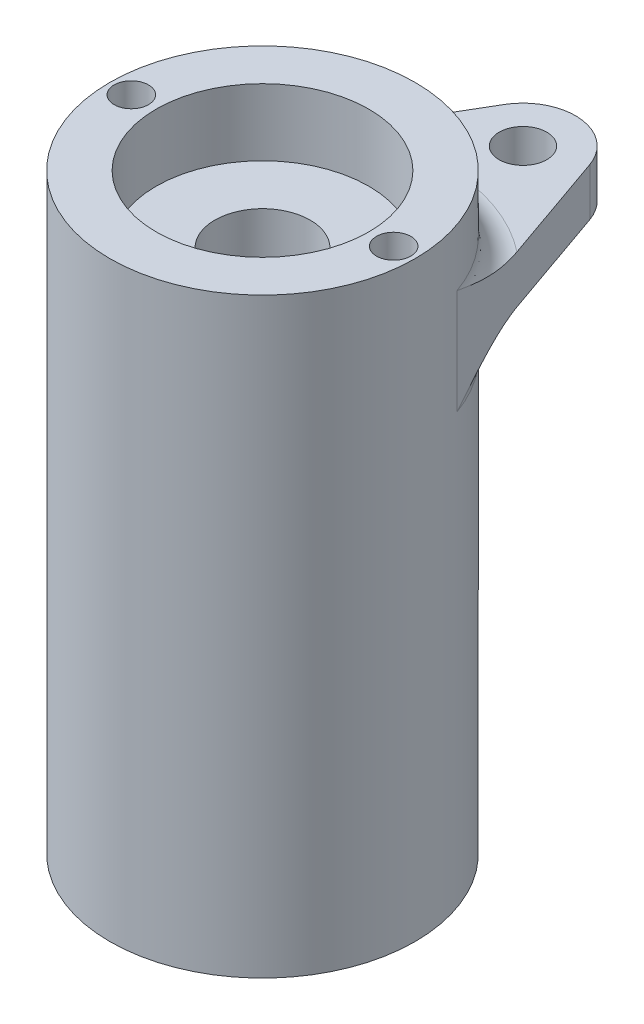
ISO-10303-21;
HEADER;
FILE_DESCRIPTION(('STEP AP214'),'2;1');
FILE_NAME('part.step','',(''),(''),'','','');
FILE_SCHEMA(('AUTOMOTIVE_DESIGN { 1 0 10303 214 1 1 1 1 }'));
ENDSEC;
DATA;
#1=APPLICATION_CONTEXT('core data for automotive mechanical design processes');
#2=APPLICATION_PROTOCOL_DEFINITION('international standard','automotive_design',2000,#1);
#3=PRODUCT_CONTEXT('',#1,'mechanical');
#4=PRODUCT('Part','Part','',(#3));
#5=PRODUCT_RELATED_PRODUCT_CATEGORY('part','',(#4));
#6=PRODUCT_DEFINITION_FORMATION('','',#4);
#7=PRODUCT_DEFINITION_CONTEXT('part definition',#1,'design');
#8=PRODUCT_DEFINITION('design','',#6,#7);
#9=PRODUCT_DEFINITION_SHAPE('','',#8);
#10=(LENGTH_UNIT() NAMED_UNIT(*) SI_UNIT(.MILLI.,.METRE.));
#11=(NAMED_UNIT(*) PLANE_ANGLE_UNIT() SI_UNIT($,.RADIAN.));
#12=(NAMED_UNIT(*) SI_UNIT($,.STERADIAN.) SOLID_ANGLE_UNIT());
#13=UNCERTAINTY_MEASURE_WITH_UNIT(LENGTH_MEASURE(1.E-05),#10,'distance_accuracy_value','');
#14=(GEOMETRIC_REPRESENTATION_CONTEXT(3) GLOBAL_UNCERTAINTY_ASSIGNED_CONTEXT((#13)) GLOBAL_UNIT_ASSIGNED_CONTEXT((#10,
#11,#12)) REPRESENTATION_CONTEXT('',''));
#15=CARTESIAN_POINT('',(0.,0.,0.));
#16=DIRECTION('',(0.,0.,1.));
#17=DIRECTION('',(1.,0.,0.));
#18=AXIS2_PLACEMENT_3D('',#15,#16,#17);
#19=CARTESIAN_POINT('',(0.,62.,0.));
#20=DIRECTION('',(0.,-1.,0.));
#21=DIRECTION('',(0.,0.,-1.));
#22=AXIS2_PLACEMENT_3D('',#19,#20,#21);
#23=CYLINDRICAL_SURFACE('',#22,16.);
#24=CARTESIAN_POINT('',(0.,0.,0.));
#25=DIRECTION('',(0.,1.,0.));
#26=DIRECTION('',(0.,0.,1.));
#27=AXIS2_PLACEMENT_3D('',#24,#25,#26);
#28=CIRCLE('',#27,16.);
#29=CARTESIAN_POINT('',(0.,0.,16.));
#30=VERTEX_POINT('',#29);
#31=EDGE_CURVE('E160',#30,#30,#28,.T.);
#32=ORIENTED_EDGE('',*,*,#31,.T.);
#33=EDGE_LOOP('',(#32));
#34=FACE_BOUND('',#33,.T.);
#35=CARTESIAN_POINT('',(0.,62.,0.));
#36=DIRECTION('',(0.,1.,0.));
#37=DIRECTION('',(0.,0.,1.));
#38=AXIS2_PLACEMENT_3D('',#35,#36,#37);
#39=CIRCLE('',#38,16.);
#40=CARTESIAN_POINT('',(0.,62.,16.));
#41=VERTEX_POINT('',#40);
#42=EDGE_CURVE('E156',#41,#41,#39,.T.);
#43=ORIENTED_EDGE('',*,*,#42,.F.);
#44=EDGE_LOOP('',(#43));
#45=FACE_BOUND('',#44,.T.);
#46=CARTESIAN_POINT('',(0.,56.,0.));
#47=DIRECTION('',(0.,1.,0.));
#48=DIRECTION('',(0.,0.,1.));
#49=AXIS2_PLACEMENT_3D('',#46,#47,#48);
#50=CIRCLE('',#49,16.);
#51=CARTESIAN_POINT('',(15.1031592391606,56.,-5.28153206906466));
#52=VERTEX_POINT('',#51);
#53=CARTESIAN_POINT('',(-13.8009834945247,56.,-8.0952365366219));
#54=VERTEX_POINT('',#53);
#55=EDGE_CURVE('E169',#52,#54,#50,.T.);
#56=ORIENTED_EDGE('',*,*,#55,.T.);
#57=DIRECTION('',(0.,1.,0.));
#58=VECTOR('',#57,1.);
#59=CARTESIAN_POINT('',(-13.8009834945246,48.,-8.0952365366219));
#60=LINE('',#59,#58);
#61=CARTESIAN_POINT('',(-13.8009834945247,45.,-8.0952365366219));
#62=VERTEX_POINT('',#61);
#63=EDGE_CURVE('E138',#62,#54,#60,.T.);
#64=ORIENTED_EDGE('',*,*,#63,.F.);
#65=CARTESIAN_POINT('',(0.,45.,0.));
#66=DIRECTION('',(0.,1.,0.));
#67=DIRECTION('',(0.,0.,1.));
#68=AXIS2_PLACEMENT_3D('',#65,#66,#67);
#69=CIRCLE('',#68,16.);
#70=CARTESIAN_POINT('',(15.1031592391606,45.,-5.28153206906466));
#71=VERTEX_POINT('',#70);
#72=EDGE_CURVE('E159',#62,#71,#69,.F.);
#73=ORIENTED_EDGE('',*,*,#72,.T.);
#74=DIRECTION('',(0.,1.,0.));
#75=VECTOR('',#74,1.);
#76=CARTESIAN_POINT('',(15.1031592391606,48.,-5.28153206906466));
#77=LINE('',#76,#75);
#78=EDGE_CURVE('E111',#71,#52,#77,.T.);
#79=ORIENTED_EDGE('',*,*,#78,.T.);
#80=EDGE_LOOP('',(#56,#64,#73,#79));
#81=FACE_BOUND('',#80,.T.);
#82=ADVANCED_FACE('F42',(#34,#45,#81),#23,.T.);
#83=CARTESIAN_POINT('',(0.,62.,0.));
#84=DIRECTION('',(0.,-1.,0.));
#85=DIRECTION('',(0.,0.,-1.));
#86=AXIS2_PLACEMENT_3D('',#83,#84,#85);
#87=CYLINDRICAL_SURFACE('',#86,5.);
#88=CARTESIAN_POINT('',(0.,55.,0.));
#89=DIRECTION('',(0.,1.,0.));
#90=DIRECTION('',(0.,0.,1.));
#91=AXIS2_PLACEMENT_3D('',#88,#89,#90);
#92=CIRCLE('',#91,5.);
#93=CARTESIAN_POINT('',(0.,55.,5.));
#94=VERTEX_POINT('',#93);
#95=EDGE_CURVE('E152',#94,#94,#92,.T.);
#96=ORIENTED_EDGE('',*,*,#95,.T.);
#97=EDGE_LOOP('',(#96));
#98=FACE_BOUND('',#97,.T.);
#99=CARTESIAN_POINT('',(0.,7.,0.));
#100=DIRECTION('',(0.,-1.,0.));
#101=DIRECTION('',(0.,0.,-1.));
#102=AXIS2_PLACEMENT_3D('',#99,#100,#101);
#103=CIRCLE('',#102,5.);
#104=CARTESIAN_POINT('',(0.,7.,-5.));
#105=VERTEX_POINT('',#104);
#106=EDGE_CURVE('E146',#105,#105,#103,.T.);
#107=ORIENTED_EDGE('',*,*,#106,.T.);
#108=EDGE_LOOP('',(#107));
#109=FACE_BOUND('',#108,.T.);
#110=ADVANCED_FACE('F201',(#98,#109),#87,.F.);
#111=CARTESIAN_POINT('',(0.,62.,0.));
#112=DIRECTION('',(0.,1.,0.));
#113=DIRECTION('',(0.,0.,1.));
#114=AXIS2_PLACEMENT_3D('',#111,#112,#113);
#115=PLANE('',#114);
#116=CARTESIAN_POINT('',(-13.75,62.,0.));
#117=DIRECTION('',(0.,1.,0.));
#118=DIRECTION('',(0.,0.,1.));
#119=AXIS2_PLACEMENT_3D('',#116,#117,#118);
#120=CIRCLE('',#119,1.8);
#121=CARTESIAN_POINT('',(-13.75,62.,1.8));
#122=VERTEX_POINT('',#121);
#123=EDGE_CURVE('E450',#122,#122,#120,.T.);
#124=ORIENTED_EDGE('',*,*,#123,.F.);
#125=EDGE_LOOP('',(#124));
#126=FACE_BOUND('',#125,.T.);
#127=CARTESIAN_POINT('',(13.75,62.,0.));
#128=DIRECTION('',(0.,1.,0.));
#129=DIRECTION('',(0.,0.,1.));
#130=AXIS2_PLACEMENT_3D('',#127,#128,#129);
#131=CIRCLE('',#130,1.8);
#132=CARTESIAN_POINT('',(13.75,62.,1.8));
#133=VERTEX_POINT('',#132);
#134=EDGE_CURVE('E447',#133,#133,#131,.T.);
#135=ORIENTED_EDGE('',*,*,#134,.F.);
#136=EDGE_LOOP('',(#135));
#137=FACE_BOUND('',#136,.T.);
#138=CARTESIAN_POINT('',(0.,62.,0.));
#139=DIRECTION('',(0.,1.,0.));
#140=DIRECTION('',(0.,0.,1.));
#141=AXIS2_PLACEMENT_3D('',#138,#139,#140);
#142=CIRCLE('',#141,11.15);
#143=CARTESIAN_POINT('',(0.,62.,11.15));
#144=VERTEX_POINT('',#143);
#145=EDGE_CURVE('E153',#144,#144,#142,.T.);
#146=ORIENTED_EDGE('',*,*,#145,.F.);
#147=EDGE_LOOP('',(#146));
#148=FACE_BOUND('',#147,.T.);
#149=ORIENTED_EDGE('',*,*,#42,.T.);
#150=EDGE_LOOP('',(#149));
#151=FACE_BOUND('',#150,.T.);
#152=ADVANCED_FACE('F207',(#126,#137,#148,#151),#115,.T.);
#153=CARTESIAN_POINT('',(0.,0.,0.));
#154=DIRECTION('',(0.,1.,0.));
#155=DIRECTION('',(0.,0.,1.));
#156=AXIS2_PLACEMENT_3D('',#153,#154,#155);
#157=PLANE('',#156);
#158=CARTESIAN_POINT('',(-13.75,0.,0.));
#159=DIRECTION('',(0.,-1.,0.));
#160=DIRECTION('',(0.,0.,-1.));
#161=AXIS2_PLACEMENT_3D('',#158,#159,#160);
#162=CIRCLE('',#161,1.8);
#163=CARTESIAN_POINT('',(-13.75,0.,-1.8));
#164=VERTEX_POINT('',#163);
#165=EDGE_CURVE('E453',#164,#164,#162,.T.);
#166=ORIENTED_EDGE('',*,*,#165,.F.);
#167=EDGE_LOOP('',(#166));
#168=FACE_BOUND('',#167,.T.);
#169=CARTESIAN_POINT('',(13.75,0.,0.));
#170=DIRECTION('',(0.,-1.,0.));
#171=DIRECTION('',(0.,0.,-1.));
#172=AXIS2_PLACEMENT_3D('',#169,#170,#171);
#173=CIRCLE('',#172,1.8);
#174=CARTESIAN_POINT('',(13.75,0.,-1.8));
#175=VERTEX_POINT('',#174);
#176=EDGE_CURVE('E460',#175,#175,#173,.T.);
#177=ORIENTED_EDGE('',*,*,#176,.F.);
#178=EDGE_LOOP('',(#177));
#179=FACE_BOUND('',#178,.T.);
#180=CARTESIAN_POINT('',(0.,0.,0.));
#181=DIRECTION('',(0.,-1.,0.));
#182=DIRECTION('',(0.,0.,-1.));
#183=AXIS2_PLACEMENT_3D('',#180,#181,#182);
#184=CIRCLE('',#183,11.15);
#185=CARTESIAN_POINT('',(0.,0.,-11.15));
#186=VERTEX_POINT('',#185);
#187=EDGE_CURVE('E140',#186,#186,#184,.T.);
#188=ORIENTED_EDGE('',*,*,#187,.F.);
#189=EDGE_LOOP('',(#188));
#190=FACE_BOUND('',#189,.T.);
#191=ORIENTED_EDGE('',*,*,#31,.F.);
#192=EDGE_LOOP('',(#191));
#193=FACE_BOUND('',#192,.T.);
#194=ADVANCED_FACE('F203',(#168,#179,#190,#193),#157,.F.);
#195=CARTESIAN_POINT('',(0.,55.,0.));
#196=DIRECTION('',(0.,1.,0.));
#197=DIRECTION('',(0.,0.,1.));
#198=AXIS2_PLACEMENT_3D('',#195,#196,#197);
#199=CYLINDRICAL_SURFACE('',#198,11.15);
#200=CARTESIAN_POINT('',(0.,55.,0.));
#201=DIRECTION('',(0.,1.,0.));
#202=DIRECTION('',(0.,0.,1.));
#203=AXIS2_PLACEMENT_3D('',#200,#201,#202);
#204=CIRCLE('',#203,11.15);
#205=CARTESIAN_POINT('',(0.,55.,11.15));
#206=VERTEX_POINT('',#205);
#207=EDGE_CURVE('E149',#206,#206,#204,.T.);
#208=ORIENTED_EDGE('',*,*,#207,.F.);
#209=EDGE_LOOP('',(#208));
#210=FACE_BOUND('',#209,.T.);
#211=ORIENTED_EDGE('',*,*,#145,.T.);
#212=EDGE_LOOP('',(#211));
#213=FACE_BOUND('',#212,.T.);
#214=ADVANCED_FACE('F206',(#210,#213),#199,.F.);
#215=CARTESIAN_POINT('',(0.,55.,0.));
#216=DIRECTION('',(0.,1.,0.));
#217=DIRECTION('',(0.,0.,1.));
#218=AXIS2_PLACEMENT_3D('',#215,#216,#217);
#219=PLANE('',#218);
#220=ORIENTED_EDGE('',*,*,#95,.F.);
#221=EDGE_LOOP('',(#220));
#222=FACE_BOUND('',#221,.T.);
#223=ORIENTED_EDGE('',*,*,#207,.T.);
#224=EDGE_LOOP('',(#223));
#225=FACE_BOUND('',#224,.T.);
#226=ADVANCED_FACE('F217',(#222,#225),#219,.T.);
#227=CARTESIAN_POINT('',(0.,7.,0.));
#228=DIRECTION('',(0.,-1.,0.));
#229=DIRECTION('',(0.,0.,-1.));
#230=AXIS2_PLACEMENT_3D('',#227,#228,#229);
#231=CYLINDRICAL_SURFACE('',#230,11.15);
#232=CARTESIAN_POINT('',(0.,7.,0.));
#233=DIRECTION('',(0.,-1.,0.));
#234=DIRECTION('',(0.,0.,-1.));
#235=AXIS2_PLACEMENT_3D('',#232,#233,#234);
#236=CIRCLE('',#235,11.15);
#237=CARTESIAN_POINT('',(0.,7.,-11.15));
#238=VERTEX_POINT('',#237);
#239=EDGE_CURVE('E143',#238,#238,#236,.T.);
#240=ORIENTED_EDGE('',*,*,#239,.F.);
#241=EDGE_LOOP('',(#240));
#242=FACE_BOUND('',#241,.T.);
#243=ORIENTED_EDGE('',*,*,#187,.T.);
#244=EDGE_LOOP('',(#243));
#245=FACE_BOUND('',#244,.T.);
#246=ADVANCED_FACE('F221',(#242,#245),#231,.F.);
#247=CARTESIAN_POINT('',(0.,7.,0.));
#248=DIRECTION('',(0.,-1.,0.));
#249=DIRECTION('',(0.,0.,-1.));
#250=AXIS2_PLACEMENT_3D('',#247,#248,#249);
#251=PLANE('',#250);
#252=ORIENTED_EDGE('',*,*,#106,.F.);
#253=EDGE_LOOP('',(#252));
#254=FACE_BOUND('',#253,.T.);
#255=ORIENTED_EDGE('',*,*,#239,.T.);
#256=EDGE_LOOP('',(#255));
#257=FACE_BOUND('',#256,.T.);
#258=ADVANCED_FACE('F225',(#254,#257),#251,.T.);
#259=CARTESIAN_POINT('',(-13.8009834945246,48.,-8.09523653662189));
#260=DIRECTION('',(-0.862561468407791,0.,-0.505952283538869));
#261=DIRECTION('',(-0.505952283538869,0.,0.862561468407791));
#262=AXIS2_PLACEMENT_3D('',#259,#260,#261);
#263=PLANE('',#262);
#264=DIRECTION('',(-0.505952283538869,0.,0.862561468407791));
#265=VECTOR('',#264,1.);
#266=CARTESIAN_POINT('',(-13.8009834945246,53.,-8.09523653662189));
#267=LINE('',#266,#265);
#268=CARTESIAN_POINT('',(-2.32188617029805,53.,-27.6651196384939));
#269=VERTEX_POINT('',#268);
#270=CARTESIAN_POINT('',(-8.61651535517702,53.,-16.9338614360104));
#271=VERTEX_POINT('',#270);
#272=EDGE_CURVE('E133',#269,#271,#267,.T.);
#273=ORIENTED_EDGE('',*,*,#272,.F.);
#274=DIRECTION('',(0.,1.,0.));
#275=VECTOR('',#274,1.);
#276=CARTESIAN_POINT('',(-2.32188617029805,48.,-27.6651196384939));
#277=LINE('',#276,#275);
#278=CARTESIAN_POINT('',(-2.32188617029805,48.,-27.6651196384939));
#279=VERTEX_POINT('',#278);
#280=EDGE_CURVE('E110',#279,#269,#277,.T.);
#281=ORIENTED_EDGE('',*,*,#280,.F.);
#282=DIRECTION('',(-0.505952283538869,0.,0.862561468407791));
#283=VECTOR('',#282,1.);
#284=CARTESIAN_POINT('',(-13.8009834945246,48.,-8.09523653662189));
#285=LINE('',#284,#283);
#286=CARTESIAN_POINT('',(-8.61651535517702,48.,-16.9338614360104));
#287=VERTEX_POINT('',#286);
#288=EDGE_CURVE('E121',#279,#287,#285,.T.);
#289=ORIENTED_EDGE('',*,*,#288,.T.);
#290=CARTESIAN_POINT('',(-8.61651535517702,48.,-16.9338614360104));
#291=CARTESIAN_POINT('',(-8.71445419242083,47.9999723465463,-16.7668925932644));
#292=CARTESIAN_POINT('',(-8.8123613365206,47.9945523342321,-16.5999777818683));
#293=CARTESIAN_POINT('',(-9.00786274585275,47.9740375800748,-16.2666815636363));
#294=CARTESIAN_POINT('',(-9.10545716102817,47.9589485200903,-16.1002999011734));
#295=CARTESIAN_POINT('',(-9.29992552323059,47.920257455875,-15.7687648503047));
#296=CARTESIAN_POINT('',(-9.39680072404127,47.8966794863374,-15.6036093244138));
#297=CARTESIAN_POINT('',(-9.59000844346445,47.8419229614435,-15.2742234522764));
#298=CARTESIAN_POINT('',(-9.6863408711389,47.8107431690484,-15.1099932610636));
#299=CARTESIAN_POINT('',(-9.97235239533583,47.7078061931678,-14.6223928917811));
#300=CARTESIAN_POINT('',(-10.1611315677937,47.6261985755592,-14.3005569291857));
#301=CARTESIAN_POINT('',(-10.536136776593,47.4419557697291,-13.6612376611709));
#302=CARTESIAN_POINT('',(-10.7223605760605,47.3393032743636,-13.3437581692362));
#303=CARTESIAN_POINT('',(-11.1537719489292,47.0806264610122,-12.6082761102034));
#304=CARTESIAN_POINT('',(-11.3979702122182,46.9182063934113,-12.1919601463898));
#305=CARTESIAN_POINT('',(-11.8825438209057,46.5729644332339,-11.3658456350812));
#306=CARTESIAN_POINT('',(-12.1229195034477,46.390144351425,-10.9560465128148));
#307=CARTESIAN_POINT('',(-12.8413362090285,45.8212504522022,-9.73126981221338));
#308=CARTESIAN_POINT('',(-13.3153466785992,45.4156255583478,-8.92316363308133));
#309=CARTESIAN_POINT('',(-13.793152963837,45.0067016446875,-8.10858624225246));
#310=CARTESIAN_POINT('',(-13.797068231779,45.0033508132231,-8.10191138500768));
#311=CARTESIAN_POINT('',(-13.8009834945247,45.,-8.09523653662189));
#312=B_SPLINE_CURVE_WITH_KNOTS('',3,(#290,#291,#292,#293,#294,#295,#296,#297,#298,#299,#300,
#301,#302,#303,#304,#305,#306,#307,#308,#309,#310,#311),.UNSPECIFIED.,.F.,.F.,(4,2,2,2,2,2,2,2,
2,2,4),(0.,0.580554602102552,1.16076836319845,1.73935211671656,2.31803008564743,
3.46297470364884,4.60886471982271,6.13587900251326,7.6627578504093,10.7247640326782,
10.7500622539597),.UNSPECIFIED.);
#313=EDGE_CURVE('E56',#287,#62,#312,.T.);
#314=ORIENTED_EDGE('',*,*,#313,.T.);
#315=ORIENTED_EDGE('',*,*,#63,.T.);
#316=CARTESIAN_POINT('',(-8.61651535517702,53.,-16.9338614360104));
#317=CARTESIAN_POINT('',(-8.71445419242083,53.0000276534537,-16.7668925932644));
#318=CARTESIAN_POINT('',(-8.8123613365206,53.0054476657679,-16.5999777818683));
#319=CARTESIAN_POINT('',(-9.00786274585275,53.0259624199252,-16.2666815636363));
#320=CARTESIAN_POINT('',(-9.10545716102817,53.0410514799097,-16.1002999011734));
#321=CARTESIAN_POINT('',(-9.29992552323059,53.079742544125,-15.7687648503047));
#322=CARTESIAN_POINT('',(-9.39680072404127,53.1033205136626,-15.6036093244138));
#323=CARTESIAN_POINT('',(-9.59000844346445,53.1580770385565,-15.2742234522764));
#324=CARTESIAN_POINT('',(-9.6863408711389,53.1892568309516,-15.1099932610636));
#325=CARTESIAN_POINT('',(-9.97235239533583,53.2921938068322,-14.6223928917811));
#326=CARTESIAN_POINT('',(-10.1611315677937,53.3738014244408,-14.3005569291857));
#327=CARTESIAN_POINT('',(-10.536136776593,53.5580442302709,-13.6612376611709));
#328=CARTESIAN_POINT('',(-10.7223605760605,53.6606967256364,-13.3437581692362));
#329=CARTESIAN_POINT('',(-11.1537719489292,53.9193735389878,-12.6082761102034));
#330=CARTESIAN_POINT('',(-11.3979702122182,54.0817936065887,-12.1919601463898));
#331=CARTESIAN_POINT('',(-11.8825438209058,54.4270355667661,-11.3658456350812));
#332=CARTESIAN_POINT('',(-12.1229195034477,54.609855648575,-10.9560465128148));
#333=CARTESIAN_POINT('',(-12.8413362090285,55.1787495477978,-9.73126981221337));
#334=CARTESIAN_POINT('',(-13.3153466785992,55.5843744416522,-8.92316363308133));
#335=CARTESIAN_POINT('',(-13.793152963837,55.9932983553125,-8.10858624225246));
#336=CARTESIAN_POINT('',(-13.797068231779,55.9966491867769,-8.10191138500768));
#337=CARTESIAN_POINT('',(-13.8009834945247,56.,-8.09523653662189));
#338=B_SPLINE_CURVE_WITH_KNOTS('',3,(#316,#317,#318,#319,#320,#321,#322,#323,#324,#325,#326,
#327,#328,#329,#330,#331,#332,#333,#334,#335,#336,#337),.UNSPECIFIED.,.F.,.F.,(4,2,2,2,2,2,2,2,
2,2,4),(0.,0.580554602102552,1.16076836319845,1.73935211671656,2.31803008564743,
3.46297470364884,4.60886471982271,6.13587900251326,7.6627578504093,10.7247640326782,
10.7500622539597),.UNSPECIFIED.);
#339=EDGE_CURVE('E176',#54,#271,#338,.F.);
#340=ORIENTED_EDGE('',*,*,#339,.T.);
#341=EDGE_LOOP('',(#273,#281,#289,#314,#315,#340));
#342=FACE_BOUND('',#341,.T.);
#343=ADVANCED_FACE('F188',(#342),#263,.T.);
#344=CARTESIAN_POINT('',(2.4222019059448,48.,-24.8823820790301));
#345=DIRECTION('',(0.,1.,0.));
#346=DIRECTION('',(0.,0.,1.));
#347=AXIS2_PLACEMENT_3D('',#344,#345,#346);
#348=CYLINDRICAL_SURFACE('',#347,5.5);
#349=CARTESIAN_POINT('',(2.4222019059448,53.,-24.8823820790301));
#350=DIRECTION('',(0.,1.,0.));
#351=DIRECTION('',(0.,0.,1.));
#352=AXIS2_PLACEMENT_3D('',#349,#350,#351);
#353=CIRCLE('',#352,5.5);
#354=CARTESIAN_POINT('',(7.61391289440625,53.,-26.6979087277711));
#355=VERTEX_POINT('',#354);
#356=EDGE_CURVE('E107',#355,#269,#353,.T.);
#357=ORIENTED_EDGE('',*,*,#356,.F.);
#358=DIRECTION('',(0.,1.,0.));
#359=VECTOR('',#358,1.);
#360=CARTESIAN_POINT('',(7.61391289440625,48.,-26.6979087277711));
#361=LINE('',#360,#359);
#362=CARTESIAN_POINT('',(7.61391289440625,48.,-26.6979087277711));
#363=VERTEX_POINT('',#362);
#364=EDGE_CURVE('E101',#363,#355,#361,.T.);
#365=ORIENTED_EDGE('',*,*,#364,.F.);
#366=CARTESIAN_POINT('',(2.4222019059448,48.,-24.8823820790301));
#367=DIRECTION('',(0.,1.,0.));
#368=DIRECTION('',(0.,0.,1.));
#369=AXIS2_PLACEMENT_3D('',#366,#367,#368);
#370=CIRCLE('',#369,5.5);
#371=EDGE_CURVE('E104',#363,#279,#370,.T.);
#372=ORIENTED_EDGE('',*,*,#371,.T.);
#373=ORIENTED_EDGE('',*,*,#280,.T.);
#374=EDGE_LOOP('',(#357,#365,#372,#373));
#375=FACE_BOUND('',#374,.T.);
#376=ADVANCED_FACE('F102',(#375),#348,.T.);
#377=CARTESIAN_POINT('',(15.1031592391606,48.,-5.28153206906466));
#378=DIRECTION('',(-0.943947452447536,0.,0.330095754316541));
#379=DIRECTION('',(0.330095754316541,0.,0.943947452447536));
#380=AXIS2_PLACEMENT_3D('',#377,#378,#379);
#381=PLANE('',#380);
#382=DIRECTION('',(0.330095754316542,0.,0.943947452447536));
#383=VECTOR('',#382,1.);
#384=CARTESIAN_POINT('',(15.1031592391606,53.,-5.28153206906466));
#385=LINE('',#384,#383);
#386=CARTESIAN_POINT('',(11.7206842966267,53.,-14.9541151399476));
#387=VERTEX_POINT('',#386);
#388=EDGE_CURVE('E129',#355,#387,#385,.T.);
#389=ORIENTED_EDGE('',*,*,#388,.T.);
#390=CARTESIAN_POINT('',(11.7206842966267,53.,-14.9541151399476));
#391=CARTESIAN_POINT('',(11.7845820107173,53.0000276534537,-14.7713921462575));
#392=CARTESIAN_POINT('',(11.8484590474187,53.005447665768,-14.5887282819826));
#393=CARTESIAN_POINT('',(11.9760089909281,53.0259624199255,-14.2239842867597));
#394=CARTESIAN_POINT('',(12.0396819955626,53.0410514799102,-14.0419038760653));
#395=CARTESIAN_POINT('',(12.1665579536337,53.0797425441259,-13.679087221104));
#396=CARTESIAN_POINT('',(12.2297617250698,53.1033205136638,-13.498348637672));
#397=CARTESIAN_POINT('',(12.3558152086848,53.1580770385582,-13.1378839447015));
#398=CARTESIAN_POINT('',(12.4186648615337,53.1892568309536,-12.9581580048247));
#399=CARTESIAN_POINT('',(12.6052658373459,53.2921938068344,-12.4245506698656));
#400=CARTESIAN_POINT('',(12.7284300276436,53.3738014244428,-12.0723482493739));
#401=CARTESIAN_POINT('',(12.9730926792374,53.5580442302719,-11.372706755471));
#402=CARTESIAN_POINT('',(13.0945896811417,53.6606967256366,-11.0252718553614));
#403=CARTESIAN_POINT('',(13.3760531060153,53.9193735389882,-10.2203942421469));
#404=CARTESIAN_POINT('',(13.5353740786556,54.0817936065904,-9.76479726981772));
#405=CARTESIAN_POINT('',(13.8515218579737,54.4270355667637,-8.86073568471148));
#406=CARTESIAN_POINT('',(14.0083488846121,54.6098556485672,-8.41227044293113));
#407=CARTESIAN_POINT('',(14.477061670494,55.1787495478113,-7.07193136138528));
#408=CARTESIAN_POINT('',(14.7863177971941,55.5843744417299,-6.18757726371719));
#409=CARTESIAN_POINT('',(15.0980504077189,55.9932983553139,-5.29614137064241));
#410=CARTESIAN_POINT('',(15.1006048251349,55.9966491867776,-5.2888367150061));
#411=CARTESIAN_POINT('',(15.1031592391606,56.,-5.28153206906466));
#412=B_SPLINE_CURVE_WITH_KNOTS('',3,(#390,#391,#392,#393,#394,#395,#396,#397,#398,#399,#400,
#401,#402,#403,#404,#405,#406,#407,#408,#409,#410,#411),.UNSPECIFIED.,.F.,.F.,(4,2,2,2,2,2,2,2,
2,2,4),(0.,0.580554602106082,1.16076836320551,1.7393521167264,2.31803008566004,3.46297470365475,
4.60886471982269,6.13587900251254,7.66275785040657,10.7247640326782,10.7500622539596),.UNSPECIFIED.);
#413=EDGE_CURVE('E183',#387,#52,#412,.T.);
#414=ORIENTED_EDGE('',*,*,#413,.T.);
#415=ORIENTED_EDGE('',*,*,#78,.F.);
#416=CARTESIAN_POINT('',(11.7206842966267,48.,-14.9541151399476));
#417=CARTESIAN_POINT('',(11.7845820107173,47.9999723465463,-14.7713921462575));
#418=CARTESIAN_POINT('',(11.8484590474187,47.994552334232,-14.5887282819826));
#419=CARTESIAN_POINT('',(11.9760089909281,47.9740375800745,-14.2239842867597));
#420=CARTESIAN_POINT('',(12.0396819955626,47.9589485200898,-14.0419038760653));
#421=CARTESIAN_POINT('',(12.1665579536337,47.9202574558741,-13.679087221104));
#422=CARTESIAN_POINT('',(12.2297617250698,47.8966794863362,-13.498348637672));
#423=CARTESIAN_POINT('',(12.3558152086848,47.8419229614418,-13.1378839447015));
#424=CARTESIAN_POINT('',(12.4186648615337,47.8107431690464,-12.9581580048247));
#425=CARTESIAN_POINT('',(12.6052658373459,47.7078061931656,-12.4245506698656));
#426=CARTESIAN_POINT('',(12.7284300276436,47.6261985755572,-12.0723482493739));
#427=CARTESIAN_POINT('',(12.9730926792374,47.4419557697281,-11.372706755471));
#428=CARTESIAN_POINT('',(13.0945896811417,47.3393032743634,-11.0252718553614));
#429=CARTESIAN_POINT('',(13.3760531060153,47.0806264610118,-10.2203942421469));
#430=CARTESIAN_POINT('',(13.5353740786556,46.9182063934096,-9.76479726981772));
#431=CARTESIAN_POINT('',(13.8515218579737,46.5729644332363,-8.86073568471148));
#432=CARTESIAN_POINT('',(14.0083488846121,46.3901443514328,-8.41227044293113));
#433=CARTESIAN_POINT('',(14.477061670494,45.8212504521887,-7.07193136138528));
#434=CARTESIAN_POINT('',(14.7863177971941,45.4156255582701,-6.18757726371719));
#435=CARTESIAN_POINT('',(15.0980504077189,45.0067016446861,-5.29614137064241));
#436=CARTESIAN_POINT('',(15.1006048251349,45.0033508132224,-5.2888367150061));
#437=CARTESIAN_POINT('',(15.1031592391606,45.,-5.28153206906466));
#438=B_SPLINE_CURVE_WITH_KNOTS('',3,(#416,#417,#418,#419,#420,#421,#422,#423,#424,#425,#426,
#427,#428,#429,#430,#431,#432,#433,#434,#435,#436,#437),.UNSPECIFIED.,.F.,.F.,(4,2,2,2,2,2,2,2,
2,2,4),(0.,0.580554602106082,1.16076836320551,1.7393521167264,2.31803008566004,3.46297470365475,
4.60886471982269,6.13587900251254,7.66275785040658,10.7247640326782,10.7500622539596),.UNSPECIFIED.);
#439=CARTESIAN_POINT('',(11.7206842966267,48.,-14.9541151399476));
#440=VERTEX_POINT('',#439);
#441=EDGE_CURVE('E11',#71,#440,#438,.F.);
#442=ORIENTED_EDGE('',*,*,#441,.T.);
#443=DIRECTION('',(0.330095754316542,0.,0.943947452447536));
#444=VECTOR('',#443,1.);
#445=CARTESIAN_POINT('',(15.1031592391606,48.,-5.28153206906466));
#446=LINE('',#445,#444);
#447=EDGE_CURVE('E113',#363,#440,#446,.T.);
#448=ORIENTED_EDGE('',*,*,#447,.F.);
#449=ORIENTED_EDGE('',*,*,#364,.T.);
#450=EDGE_LOOP('',(#389,#414,#415,#442,#448,#449));
#451=FACE_BOUND('',#450,.T.);
#452=ADVANCED_FACE('F114',(#451),#381,.F.);
#453=CARTESIAN_POINT('',(2.4222019059448,48.,-24.8823820790301));
#454=DIRECTION('',(0.,1.,0.));
#455=DIRECTION('',(0.,0.,1.));
#456=AXIS2_PLACEMENT_3D('',#453,#454,#455);
#457=CYLINDRICAL_SURFACE('',#456,2.5);
#458=CARTESIAN_POINT('',(2.4222019059448,48.,-24.8823820790301));
#459=DIRECTION('',(0.,1.,0.));
#460=DIRECTION('',(0.,0.,1.));
#461=AXIS2_PLACEMENT_3D('',#458,#459,#460);
#462=CIRCLE('',#461,2.5);
#463=CARTESIAN_POINT('',(2.4222019059448,48.,-22.3823820790301));
#464=VERTEX_POINT('',#463);
#465=EDGE_CURVE('E123',#464,#464,#462,.T.);
#466=ORIENTED_EDGE('',*,*,#465,.F.);
#467=EDGE_LOOP('',(#466));
#468=FACE_BOUND('',#467,.T.);
#469=CARTESIAN_POINT('',(2.4222019059448,53.,-24.8823820790301));
#470=DIRECTION('',(0.,1.,0.));
#471=DIRECTION('',(0.,0.,1.));
#472=AXIS2_PLACEMENT_3D('',#469,#470,#471);
#473=CIRCLE('',#472,2.5);
#474=CARTESIAN_POINT('',(2.4222019059448,53.,-22.3823820790301));
#475=VERTEX_POINT('',#474);
#476=EDGE_CURVE('E116',#475,#475,#473,.T.);
#477=ORIENTED_EDGE('',*,*,#476,.T.);
#478=EDGE_LOOP('',(#477));
#479=FACE_BOUND('',#478,.T.);
#480=ADVANCED_FACE('F231',(#468,#479),#457,.F.);
#481=CARTESIAN_POINT('',(0.,48.,0.));
#482=DIRECTION('',(0.,1.,0.));
#483=DIRECTION('',(0.,0.,1.));
#484=AXIS2_PLACEMENT_3D('',#481,#482,#483);
#485=PLANE('',#484);
#486=ORIENTED_EDGE('',*,*,#447,.T.);
#487=CARTESIAN_POINT('',(0.,48.,0.));
#488=DIRECTION('',(0.,1.,0.));
#489=DIRECTION('',(0.,0.,1.));
#490=AXIS2_PLACEMENT_3D('',#487,#488,#489);
#491=CIRCLE('',#490,19.);
#492=EDGE_CURVE('E174',#440,#287,#491,.T.);
#493=ORIENTED_EDGE('',*,*,#492,.T.);
#494=ORIENTED_EDGE('',*,*,#288,.F.);
#495=ORIENTED_EDGE('',*,*,#371,.F.);
#496=EDGE_LOOP('',(#486,#493,#494,#495));
#497=FACE_BOUND('',#496,.T.);
#498=ORIENTED_EDGE('',*,*,#465,.T.);
#499=EDGE_LOOP('',(#498));
#500=FACE_BOUND('',#499,.T.);
#501=ADVANCED_FACE('F118',(#497,#500),#485,.F.);
#502=CARTESIAN_POINT('',(0.,53.,0.));
#503=DIRECTION('',(0.,1.,0.));
#504=DIRECTION('',(0.,0.,1.));
#505=AXIS2_PLACEMENT_3D('',#502,#503,#504);
#506=PLANE('',#505);
#507=ORIENTED_EDGE('',*,*,#272,.T.);
#508=CARTESIAN_POINT('',(0.,53.,0.));
#509=DIRECTION('',(0.,1.,0.));
#510=DIRECTION('',(0.,0.,1.));
#511=AXIS2_PLACEMENT_3D('',#508,#509,#510);
#512=CIRCLE('',#511,19.);
#513=EDGE_CURVE('E172',#271,#387,#512,.F.);
#514=ORIENTED_EDGE('',*,*,#513,.T.);
#515=ORIENTED_EDGE('',*,*,#388,.F.);
#516=ORIENTED_EDGE('',*,*,#356,.T.);
#517=EDGE_LOOP('',(#507,#514,#515,#516));
#518=FACE_BOUND('',#517,.T.);
#519=ORIENTED_EDGE('',*,*,#476,.F.);
#520=EDGE_LOOP('',(#519));
#521=FACE_BOUND('',#520,.T.);
#522=ADVANCED_FACE('F245',(#518,#521),#506,.T.);
#523=CARTESIAN_POINT('',(13.75,56.,0.));
#524=DIRECTION('',(0.,1.,0.));
#525=DIRECTION('',(0.,0.,1.));
#526=AXIS2_PLACEMENT_3D('',#523,#524,#525);
#527=CYLINDRICAL_SURFACE('',#526,1.8);
#528=CARTESIAN_POINT('',(13.75,56.,0.));
#529=DIRECTION('',(0.,1.,0.));
#530=DIRECTION('',(0.,0.,1.));
#531=AXIS2_PLACEMENT_3D('',#528,#529,#530);
#532=CIRCLE('',#531,1.8);
#533=CARTESIAN_POINT('',(13.75,56.,1.8));
#534=VERTEX_POINT('',#533);
#535=EDGE_CURVE('E444',#534,#534,#532,.T.);
#536=ORIENTED_EDGE('',*,*,#535,.F.);
#537=EDGE_LOOP('',(#536));
#538=FACE_BOUND('',#537,.T.);
#539=ORIENTED_EDGE('',*,*,#134,.T.);
#540=EDGE_LOOP('',(#539));
#541=FACE_BOUND('',#540,.T.);
#542=ADVANCED_FACE('F317',(#538,#541),#527,.F.);
#543=CARTESIAN_POINT('',(13.75,56.,0.));
#544=DIRECTION('',(0.,1.,0.));
#545=DIRECTION('',(0.,0.,1.));
#546=AXIS2_PLACEMENT_3D('',#543,#544,#545);
#547=PLANE('',#546);
#548=ORIENTED_EDGE('',*,*,#535,.T.);
#549=EDGE_LOOP('',(#548));
#550=FACE_BOUND('',#549,.T.);
#551=ADVANCED_FACE('F309',(#550),#547,.T.);
#552=CARTESIAN_POINT('',(-13.75,56.,0.));
#553=DIRECTION('',(0.,1.,0.));
#554=DIRECTION('',(0.,0.,1.));
#555=AXIS2_PLACEMENT_3D('',#552,#553,#554);
#556=CYLINDRICAL_SURFACE('',#555,1.8);
#557=CARTESIAN_POINT('',(-13.75,56.,0.));
#558=DIRECTION('',(0.,1.,0.));
#559=DIRECTION('',(0.,0.,1.));
#560=AXIS2_PLACEMENT_3D('',#557,#558,#559);
#561=CIRCLE('',#560,1.8);
#562=CARTESIAN_POINT('',(-13.75,56.,1.8));
#563=VERTEX_POINT('',#562);
#564=EDGE_CURVE('E131',#563,#563,#561,.T.);
#565=ORIENTED_EDGE('',*,*,#564,.F.);
#566=EDGE_LOOP('',(#565));
#567=FACE_BOUND('',#566,.T.);
#568=ORIENTED_EDGE('',*,*,#123,.T.);
#569=EDGE_LOOP('',(#568));
#570=FACE_BOUND('',#569,.T.);
#571=ADVANCED_FACE('F301',(#567,#570),#556,.F.);
#572=CARTESIAN_POINT('',(-13.75,56.,0.));
#573=DIRECTION('',(0.,1.,0.));
#574=DIRECTION('',(0.,0.,1.));
#575=AXIS2_PLACEMENT_3D('',#572,#573,#574);
#576=PLANE('',#575);
#577=ORIENTED_EDGE('',*,*,#564,.T.);
#578=EDGE_LOOP('',(#577));
#579=FACE_BOUND('',#578,.T.);
#580=ADVANCED_FACE('F293',(#579),#576,.T.);
#581=CARTESIAN_POINT('',(13.75,6.,0.));
#582=DIRECTION('',(0.,-1.,0.));
#583=DIRECTION('',(0.,0.,-1.));
#584=AXIS2_PLACEMENT_3D('',#581,#582,#583);
#585=CYLINDRICAL_SURFACE('',#584,1.8);
#586=CARTESIAN_POINT('',(13.75,6.,0.));
#587=DIRECTION('',(0.,-1.,0.));
#588=DIRECTION('',(0.,0.,-1.));
#589=AXIS2_PLACEMENT_3D('',#586,#587,#588);
#590=CIRCLE('',#589,1.8);
#591=CARTESIAN_POINT('',(13.75,6.,-1.8));
#592=VERTEX_POINT('',#591);
#593=EDGE_CURVE('E463',#592,#592,#590,.T.);
#594=ORIENTED_EDGE('',*,*,#593,.F.);
#595=EDGE_LOOP('',(#594));
#596=FACE_BOUND('',#595,.T.);
#597=ORIENTED_EDGE('',*,*,#176,.T.);
#598=EDGE_LOOP('',(#597));
#599=FACE_BOUND('',#598,.T.);
#600=ADVANCED_FACE('F285',(#596,#599),#585,.F.);
#601=CARTESIAN_POINT('',(13.75,6.,0.));
#602=DIRECTION('',(0.,-1.,0.));
#603=DIRECTION('',(0.,0.,-1.));
#604=AXIS2_PLACEMENT_3D('',#601,#602,#603);
#605=PLANE('',#604);
#606=ORIENTED_EDGE('',*,*,#593,.T.);
#607=EDGE_LOOP('',(#606));
#608=FACE_BOUND('',#607,.T.);
#609=ADVANCED_FACE('F277',(#608),#605,.T.);
#610=CARTESIAN_POINT('',(-13.75,6.,0.));
#611=DIRECTION('',(0.,-1.,0.));
#612=DIRECTION('',(0.,0.,-1.));
#613=AXIS2_PLACEMENT_3D('',#610,#611,#612);
#614=CYLINDRICAL_SURFACE('',#613,1.8);
#615=CARTESIAN_POINT('',(-13.75,6.,0.));
#616=DIRECTION('',(0.,-1.,0.));
#617=DIRECTION('',(0.,0.,-1.));
#618=AXIS2_PLACEMENT_3D('',#615,#616,#617);
#619=CIRCLE('',#618,1.8);
#620=CARTESIAN_POINT('',(-13.75,6.,-1.8));
#621=VERTEX_POINT('',#620);
#622=EDGE_CURVE('E449',#621,#621,#619,.T.);
#623=ORIENTED_EDGE('',*,*,#622,.F.);
#624=EDGE_LOOP('',(#623));
#625=FACE_BOUND('',#624,.T.);
#626=ORIENTED_EDGE('',*,*,#165,.T.);
#627=EDGE_LOOP('',(#626));
#628=FACE_BOUND('',#627,.T.);
#629=ADVANCED_FACE('F269',(#625,#628),#614,.F.);
#630=CARTESIAN_POINT('',(-13.75,6.,0.));
#631=DIRECTION('',(0.,-1.,0.));
#632=DIRECTION('',(0.,0.,-1.));
#633=AXIS2_PLACEMENT_3D('',#630,#631,#632);
#634=PLANE('',#633);
#635=ORIENTED_EDGE('',*,*,#622,.T.);
#636=EDGE_LOOP('',(#635));
#637=FACE_BOUND('',#636,.T.);
#638=ADVANCED_FACE('F196',(#637),#634,.T.);
#639=CARTESIAN_POINT('',(0.,56.,0.));
#640=DIRECTION('',(0.,1.,0.));
#641=DIRECTION('',(0.,0.,1.));
#642=AXIS2_PLACEMENT_3D('',#639,#640,#641);
#643=TOROIDAL_SURFACE('',#642,19.,3.);
#644=ORIENTED_EDGE('',*,*,#413,.F.);
#645=ORIENTED_EDGE('',*,*,#513,.F.);
#646=ORIENTED_EDGE('',*,*,#339,.F.);
#647=ORIENTED_EDGE('',*,*,#55,.F.);
#648=EDGE_LOOP('',(#644,#645,#646,#647));
#649=FACE_BOUND('',#648,.T.);
#650=ADVANCED_FACE('F192',(#649),#643,.F.);
#651=CARTESIAN_POINT('',(0.,45.,0.));
#652=DIRECTION('',(0.,1.,0.));
#653=DIRECTION('',(0.,0.,1.));
#654=AXIS2_PLACEMENT_3D('',#651,#652,#653);
#655=TOROIDAL_SURFACE('',#654,19.,3.);
#656=ORIENTED_EDGE('',*,*,#441,.F.);
#657=ORIENTED_EDGE('',*,*,#72,.F.);
#658=ORIENTED_EDGE('',*,*,#313,.F.);
#659=ORIENTED_EDGE('',*,*,#492,.F.);
#660=EDGE_LOOP('',(#656,#657,#658,#659));
#661=FACE_BOUND('',#660,.T.);
#662=ADVANCED_FACE('F44',(#661),#655,.F.);
#663=CLOSED_SHELL('',(#82,#110,#152,#194,#214,#226,#246,#258,#343,#376,#452,#480,#501,#522,#542,
#551,#571,#580,#600,#609,#629,#638,#650,#662));
#664=MANIFOLD_SOLID_BREP('B2',#663);
#665=ADVANCED_BREP_SHAPE_REPRESENTATION('',(#18,#664),#14);
#666=SHAPE_DEFINITION_REPRESENTATION(#9,#665);
ENDSEC;
END-ISO-10303-21;
